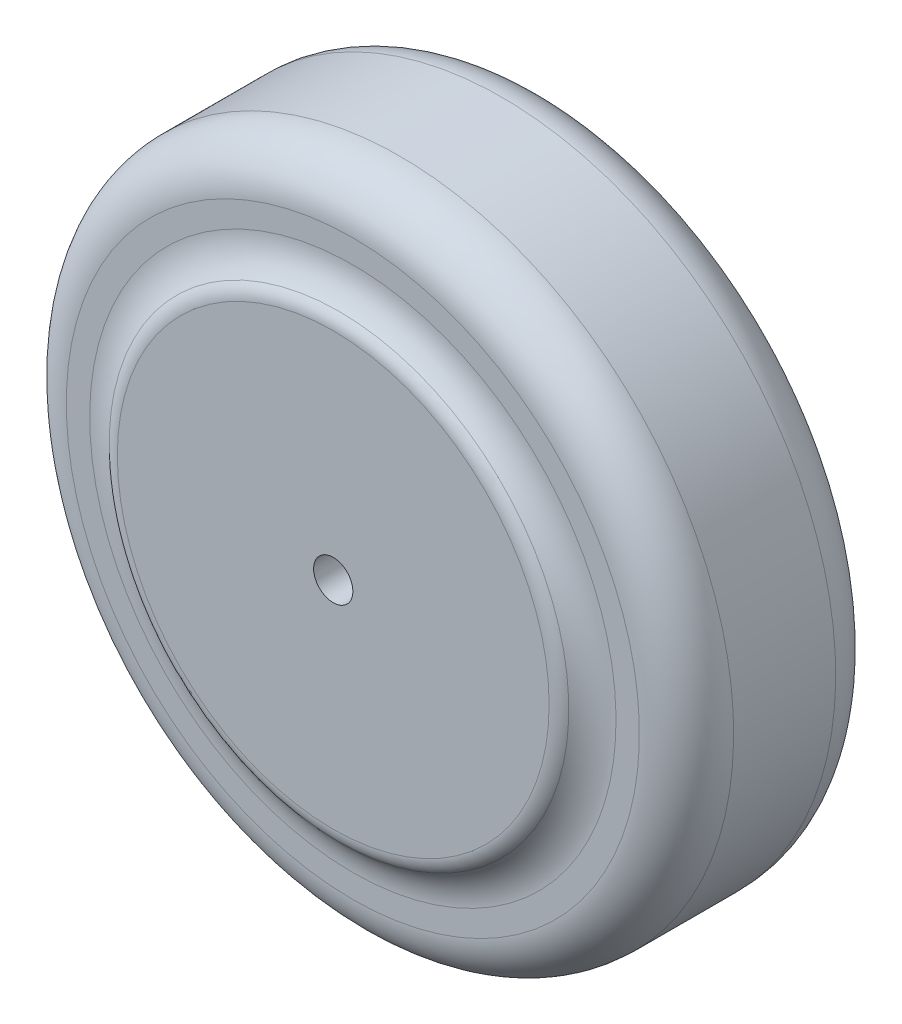
ISO-10303-21;
HEADER;
FILE_DESCRIPTION(('STEP AP214'),'2;1');
FILE_NAME('part.step','',(''),(''),'','','');
FILE_SCHEMA(('AUTOMOTIVE_DESIGN { 1 0 10303 214 1 1 1 1 }'));
ENDSEC;
DATA;
#1=APPLICATION_CONTEXT('core data for automotive mechanical design processes');
#2=APPLICATION_PROTOCOL_DEFINITION('international standard','automotive_design',2000,#1);
#3=PRODUCT_CONTEXT('',#1,'mechanical');
#4=PRODUCT('Part','Part','',(#3));
#5=PRODUCT_RELATED_PRODUCT_CATEGORY('part','',(#4));
#6=PRODUCT_DEFINITION_FORMATION('','',#4);
#7=PRODUCT_DEFINITION_CONTEXT('part definition',#1,'design');
#8=PRODUCT_DEFINITION('design','',#6,#7);
#9=PRODUCT_DEFINITION_SHAPE('','',#8);
#10=(LENGTH_UNIT() NAMED_UNIT(*) SI_UNIT(.MILLI.,.METRE.));
#11=(NAMED_UNIT(*) PLANE_ANGLE_UNIT() SI_UNIT($,.RADIAN.));
#12=(NAMED_UNIT(*) SI_UNIT($,.STERADIAN.) SOLID_ANGLE_UNIT());
#13=UNCERTAINTY_MEASURE_WITH_UNIT(LENGTH_MEASURE(1.E-05),#10,'distance_accuracy_value','');
#14=(GEOMETRIC_REPRESENTATION_CONTEXT(3) GLOBAL_UNCERTAINTY_ASSIGNED_CONTEXT((#13)) GLOBAL_UNIT_ASSIGNED_CONTEXT((#10,
#11,#12)) REPRESENTATION_CONTEXT('',''));
#15=CARTESIAN_POINT('',(0.,0.,0.));
#16=DIRECTION('',(0.,0.,1.));
#17=DIRECTION('',(1.,0.,0.));
#18=AXIS2_PLACEMENT_3D('',#15,#16,#17);
#19=CARTESIAN_POINT('',(0.,9.99999999999986,40.));
#20=DIRECTION('',(0.,0.,-1.));
#21=DIRECTION('',(0.,1.,0.));
#22=AXIS2_PLACEMENT_3D('',#19,#20,#21);
#23=CYLINDRICAL_SURFACE('',#22,85.);
#24=CARTESIAN_POINT('',(0.,9.9999999999999,28.));
#25=DIRECTION('',(0.,0.,1.));
#26=DIRECTION('',(0.,-1.,0.));
#27=AXIS2_PLACEMENT_3D('',#24,#25,#26);
#28=CIRCLE('',#27,85.);
#29=CARTESIAN_POINT('',(0.,-75.0000000000001,27.9999999999997));
#30=VERTEX_POINT('',#29);
#31=EDGE_CURVE('E48',#30,#30,#28,.F.);
#32=ORIENTED_EDGE('',*,*,#31,.T.);
#33=EDGE_LOOP('',(#32));
#34=FACE_BOUND('',#33,.T.);
#35=CARTESIAN_POINT('',(0.,9.99999999999999,2.));
#36=DIRECTION('',(0.,0.,1.));
#37=DIRECTION('',(0.,-1.,0.));
#38=AXIS2_PLACEMENT_3D('',#35,#36,#37);
#39=CIRCLE('',#38,85.);
#40=CARTESIAN_POINT('',(0.,-75.,1.99999999999971));
#41=VERTEX_POINT('',#40);
#42=EDGE_CURVE('E52',#41,#41,#39,.T.);
#43=ORIENTED_EDGE('',*,*,#42,.T.);
#44=EDGE_LOOP('',(#43));
#45=FACE_BOUND('',#44,.T.);
#46=ADVANCED_FACE('F37',(#34,#45),#23,.T.);
#47=CARTESIAN_POINT('',(0.,9.99999999999986,40.));
#48=DIRECTION('',(0.,0.,1.));
#49=DIRECTION('',(0.,-1.,0.));
#50=AXIS2_PLACEMENT_3D('',#47,#48,#49);
#51=PLANE('',#50);
#52=CARTESIAN_POINT('',(0.,9.99999999999986,40.));
#53=DIRECTION('',(0.,0.,1.));
#54=DIRECTION('',(0.,-1.,0.));
#55=AXIS2_PLACEMENT_3D('',#52,#53,#54);
#56=CIRCLE('',#55,73.);
#57=CARTESIAN_POINT('',(0.,-63.0000000000002,39.9999999999998));
#58=VERTEX_POINT('',#57);
#59=EDGE_CURVE('E57',#58,#58,#56,.T.);
#60=ORIENTED_EDGE('',*,*,#59,.T.);
#61=EDGE_LOOP('',(#60));
#62=FACE_BOUND('',#61,.T.);
#63=CARTESIAN_POINT('',(0.,9.99999999999986,40.));
#64=DIRECTION('',(0.,0.,1.));
#65=DIRECTION('',(0.,-1.,0.));
#66=AXIS2_PLACEMENT_3D('',#63,#64,#65);
#67=CIRCLE('',#66,67.0415945787923);
#68=CARTESIAN_POINT('',(0.,-57.0415945787924,39.9999999999998));
#69=VERTEX_POINT('',#68);
#70=EDGE_CURVE('E60',#69,#69,#67,.F.);
#71=ORIENTED_EDGE('',*,*,#70,.T.);
#72=EDGE_LOOP('',(#71));
#73=FACE_BOUND('',#72,.T.);
#74=ADVANCED_FACE('F93',(#62,#73),#51,.T.);
#75=CARTESIAN_POINT('',(0.,10.,-10.));
#76=DIRECTION('',(0.,0.,1.));
#77=DIRECTION('',(0.,-1.,0.));
#78=AXIS2_PLACEMENT_3D('',#75,#76,#77);
#79=PLANE('',#78);
#80=CARTESIAN_POINT('',(0.,10.,-10.));
#81=DIRECTION('',(0.,0.,1.));
#82=DIRECTION('',(0.,-1.,0.));
#83=AXIS2_PLACEMENT_3D('',#80,#81,#82);
#84=CIRCLE('',#83,73.);
#85=CARTESIAN_POINT('',(0.,-63.,-10.0000000000003));
#86=VERTEX_POINT('',#85);
#87=EDGE_CURVE('E10',#86,#86,#84,.F.);
#88=ORIENTED_EDGE('',*,*,#87,.T.);
#89=EDGE_LOOP('',(#88));
#90=FACE_BOUND('',#89,.T.);
#91=CARTESIAN_POINT('',(0.,10.,-10.));
#92=DIRECTION('',(0.,0.,-1.));
#93=DIRECTION('',(0.,1.,0.));
#94=AXIS2_PLACEMENT_3D('',#91,#92,#93);
#95=CIRCLE('',#94,60.);
#96=CARTESIAN_POINT('',(0.,70.,-9.99999999999979));
#97=VERTEX_POINT('',#96);
#98=EDGE_CURVE('E69',#97,#97,#95,.T.);
#99=ORIENTED_EDGE('',*,*,#98,.F.);
#100=EDGE_LOOP('',(#99));
#101=FACE_BOUND('',#100,.T.);
#102=ADVANCED_FACE('F84',(#90,#101),#79,.F.);
#103=CARTESIAN_POINT('',(0.,9.99999999999984,45.));
#104=DIRECTION('',(0.,0.,1.));
#105=DIRECTION('',(0.,-1.,0.));
#106=AXIS2_PLACEMENT_3D('',#103,#104,#105);
#107=PLANE('',#106);
#108=CARTESIAN_POINT('',(0.,9.99999999999984,45.));
#109=DIRECTION('',(0.,0.,1.));
#110=DIRECTION('',(0.,-1.,0.));
#111=AXIS2_PLACEMENT_3D('',#108,#109,#110);
#112=CIRCLE('',#111,55.);
#113=CARTESIAN_POINT('',(0.,-45.0000000000002,44.9999999999998));
#114=VERTEX_POINT('',#113);
#115=EDGE_CURVE('E63',#114,#114,#112,.T.);
#116=ORIENTED_EDGE('',*,*,#115,.T.);
#117=EDGE_LOOP('',(#116));
#118=FACE_BOUND('',#117,.T.);
#119=CARTESIAN_POINT('',(0.,9.99999999999984,45.));
#120=DIRECTION('',(0.,0.,1.));
#121=DIRECTION('',(0.,-1.,0.));
#122=AXIS2_PLACEMENT_3D('',#119,#120,#121);
#123=CIRCLE('',#122,5.);
#124=CARTESIAN_POINT('',(0.,4.99999999999984,45.));
#125=VERTEX_POINT('',#124);
#126=EDGE_CURVE('E73',#125,#125,#123,.T.);
#127=ORIENTED_EDGE('',*,*,#126,.F.);
#128=EDGE_LOOP('',(#127));
#129=FACE_BOUND('',#128,.T.);
#130=ADVANCED_FACE('F81',(#118,#129),#107,.T.);
#131=CARTESIAN_POINT('',(0.,10.,-15.));
#132=DIRECTION('',(0.,0.,-1.));
#133=DIRECTION('',(0.,1.,0.));
#134=AXIS2_PLACEMENT_3D('',#131,#132,#133);
#135=PLANE('',#134);
#136=CARTESIAN_POINT('',(0.,10.,-15.));
#137=DIRECTION('',(0.,0.,-1.));
#138=DIRECTION('',(0.,1.,0.));
#139=AXIS2_PLACEMENT_3D('',#136,#137,#138);
#140=CIRCLE('',#139,55.);
#141=CARTESIAN_POINT('',(0.,65.0000000000001,-14.9999999999998));
#142=VERTEX_POINT('',#141);
#143=EDGE_CURVE('E66',#142,#142,#140,.T.);
#144=ORIENTED_EDGE('',*,*,#143,.T.);
#145=EDGE_LOOP('',(#144));
#146=FACE_BOUND('',#145,.T.);
#147=CARTESIAN_POINT('',(0.,10.,-15.));
#148=DIRECTION('',(0.,0.,-1.));
#149=DIRECTION('',(0.,1.,0.));
#150=AXIS2_PLACEMENT_3D('',#147,#148,#149);
#151=CIRCLE('',#150,5.);
#152=CARTESIAN_POINT('',(0.,15.0000000000001,-15.));
#153=VERTEX_POINT('',#152);
#154=EDGE_CURVE('E70',#153,#153,#151,.T.);
#155=ORIENTED_EDGE('',*,*,#154,.F.);
#156=EDGE_LOOP('',(#155));
#157=FACE_BOUND('',#156,.T.);
#158=ADVANCED_FACE('F83',(#146,#157),#135,.T.);
#159=CARTESIAN_POINT('',(0.,10.0000000000002,-55.));
#160=DIRECTION('',(0.,0.,1.));
#161=DIRECTION('',(0.,-1.,0.));
#162=AXIS2_PLACEMENT_3D('',#159,#160,#161);
#163=CYLINDRICAL_SURFACE('',#162,5.);
#164=ORIENTED_EDGE('',*,*,#154,.T.);
#165=EDGE_LOOP('',(#164));
#166=FACE_BOUND('',#165,.T.);
#167=ORIENTED_EDGE('',*,*,#126,.T.);
#168=EDGE_LOOP('',(#167));
#169=FACE_BOUND('',#168,.T.);
#170=ADVANCED_FACE('F79',(#166,#169),#163,.F.);
#171=CARTESIAN_POINT('',(0.,10.,-10.));
#172=DIRECTION('',(0.,0.,-1.));
#173=DIRECTION('',(0.,1.,0.));
#174=AXIS2_PLACEMENT_3D('',#171,#172,#173);
#175=TOROIDAL_SURFACE('',#174,55.,5.);
#176=ORIENTED_EDGE('',*,*,#98,.T.);
#177=EDGE_LOOP('',(#176));
#178=FACE_BOUND('',#177,.T.);
#179=ORIENTED_EDGE('',*,*,#143,.F.);
#180=EDGE_LOOP('',(#179));
#181=FACE_BOUND('',#180,.T.);
#182=ADVANCED_FACE('F105',(#178,#181),#175,.T.);
#183=CARTESIAN_POINT('',(0.,9.99999999999986,40.));
#184=DIRECTION('',(0.,0.,1.));
#185=DIRECTION('',(0.,-1.,0.));
#186=AXIS2_PLACEMENT_3D('',#183,#184,#185);
#187=TOROIDAL_SURFACE('',#186,55.,5.);
#188=CARTESIAN_POINT('',(0.,9.99999999999985,43.5294117647056));
#189=DIRECTION('',(0.,0.,-1.));
#190=DIRECTION('',(0.,1.,0.));
#191=AXIS2_PLACEMENT_3D('',#188,#189,#190);
#192=CIRCLE('',#191,58.5416454643504);
#193=CARTESIAN_POINT('',(0.,68.5416454643502,43.5294117647058));
#194=VERTEX_POINT('',#193);
#195=EDGE_CURVE('E44',#194,#194,#192,.F.);
#196=ORIENTED_EDGE('',*,*,#195,.T.);
#197=EDGE_LOOP('',(#196));
#198=FACE_BOUND('',#197,.T.);
#199=ORIENTED_EDGE('',*,*,#115,.F.);
#200=EDGE_LOOP('',(#199));
#201=FACE_BOUND('',#200,.T.);
#202=ADVANCED_FACE('F108',(#198,#201),#187,.T.);
#203=CARTESIAN_POINT('',(0.,9.9999999999999,28.));
#204=DIRECTION('',(0.,0.,1.));
#205=DIRECTION('',(0.,-1.,0.));
#206=AXIS2_PLACEMENT_3D('',#203,#204,#205);
#207=TOROIDAL_SURFACE('',#206,73.,12.);
#208=ORIENTED_EDGE('',*,*,#31,.F.);
#209=EDGE_LOOP('',(#208));
#210=FACE_BOUND('',#209,.T.);
#211=ORIENTED_EDGE('',*,*,#59,.F.);
#212=EDGE_LOOP('',(#211));
#213=FACE_BOUND('',#212,.T.);
#214=ADVANCED_FACE('F112',(#210,#213),#207,.T.);
#215=CARTESIAN_POINT('',(0.,9.99999999999982,52.));
#216=DIRECTION('',(0.,0.,1.));
#217=DIRECTION('',(0.,-1.,0.));
#218=AXIS2_PLACEMENT_3D('',#215,#216,#217);
#219=TOROIDAL_SURFACE('',#218,67.0415945787923,12.);
#220=ORIENTED_EDGE('',*,*,#70,.F.);
#221=EDGE_LOOP('',(#220));
#222=FACE_BOUND('',#221,.T.);
#223=ORIENTED_EDGE('',*,*,#195,.F.);
#224=EDGE_LOOP('',(#223));
#225=FACE_BOUND('',#224,.T.);
#226=ADVANCED_FACE('F114',(#222,#225),#219,.F.);
#227=CARTESIAN_POINT('',(0.,9.99999999999999,2.));
#228=DIRECTION('',(0.,0.,1.));
#229=DIRECTION('',(0.,-1.,0.));
#230=AXIS2_PLACEMENT_3D('',#227,#228,#229);
#231=TOROIDAL_SURFACE('',#230,73.,12.);
#232=ORIENTED_EDGE('',*,*,#87,.F.);
#233=EDGE_LOOP('',(#232));
#234=FACE_BOUND('',#233,.T.);
#235=ORIENTED_EDGE('',*,*,#42,.F.);
#236=EDGE_LOOP('',(#235));
#237=FACE_BOUND('',#236,.T.);
#238=ADVANCED_FACE('F39',(#234,#237),#231,.T.);
#239=CLOSED_SHELL('',(#46,#74,#102,#130,#158,#170,#182,#202,#214,#226,#238));
#240=MANIFOLD_SOLID_BREP('B2',#239);
#241=ADVANCED_BREP_SHAPE_REPRESENTATION('',(#18,#240),#14);
#242=SHAPE_DEFINITION_REPRESENTATION(#9,#241);
ENDSEC;
END-ISO-10303-21;
